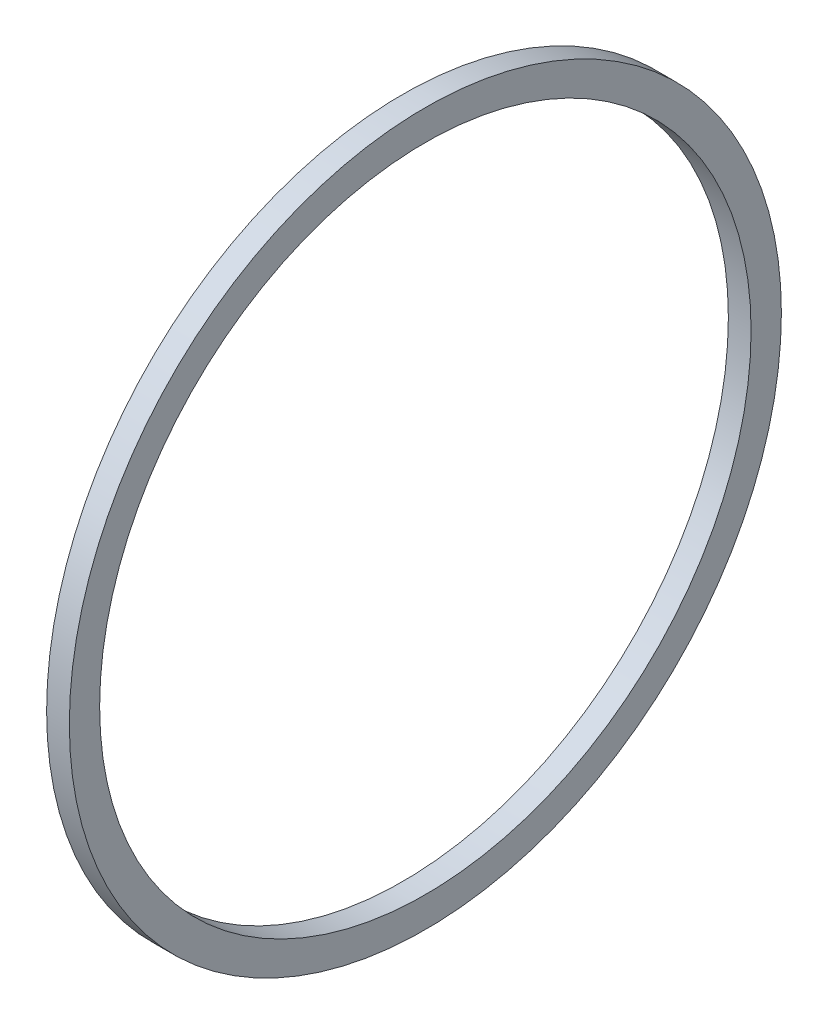
ISO-10303-21;
HEADER;
FILE_DESCRIPTION(('STEP AP214'),'2;1');
FILE_NAME('part.step','',(''),(''),'','','');
FILE_SCHEMA(('AUTOMOTIVE_DESIGN { 1 0 10303 214 1 1 1 1 }'));
ENDSEC;
DATA;
#1=APPLICATION_CONTEXT('core data for automotive mechanical design processes');
#2=APPLICATION_PROTOCOL_DEFINITION('international standard','automotive_design',2000,#1);
#3=PRODUCT_CONTEXT('',#1,'mechanical');
#4=PRODUCT('Part','Part','',(#3));
#5=PRODUCT_RELATED_PRODUCT_CATEGORY('part','',(#4));
#6=PRODUCT_DEFINITION_FORMATION('','',#4);
#7=PRODUCT_DEFINITION_CONTEXT('part definition',#1,'design');
#8=PRODUCT_DEFINITION('design','',#6,#7);
#9=PRODUCT_DEFINITION_SHAPE('','',#8);
#10=(LENGTH_UNIT() NAMED_UNIT(*) SI_UNIT(.MILLI.,.METRE.));
#11=(NAMED_UNIT(*) PLANE_ANGLE_UNIT() SI_UNIT($,.RADIAN.));
#12=(NAMED_UNIT(*) SI_UNIT($,.STERADIAN.) SOLID_ANGLE_UNIT());
#13=UNCERTAINTY_MEASURE_WITH_UNIT(LENGTH_MEASURE(1.E-05),#10,'distance_accuracy_value','');
#14=(GEOMETRIC_REPRESENTATION_CONTEXT(3) GLOBAL_UNCERTAINTY_ASSIGNED_CONTEXT((#13)) GLOBAL_UNIT_ASSIGNED_CONTEXT((#10,
#11,#12)) REPRESENTATION_CONTEXT('',''));
#15=CARTESIAN_POINT('',(0.,0.,0.));
#16=DIRECTION('',(0.,0.,1.));
#17=DIRECTION('',(1.,0.,0.));
#18=AXIS2_PLACEMENT_3D('',#15,#16,#17);
#19=CARTESIAN_POINT('',(3.,0.,0.));
#20=DIRECTION('',(1.,0.,0.));
#21=DIRECTION('',(0.,0.,-1.));
#22=AXIS2_PLACEMENT_3D('',#19,#20,#21);
#23=PLANE('',#22);
#24=CARTESIAN_POINT('',(3.,0.,0.));
#25=DIRECTION('',(1.,0.,0.));
#26=DIRECTION('',(0.,0.,-1.));
#27=AXIS2_PLACEMENT_3D('',#24,#25,#26);
#28=CIRCLE('',#27,47.);
#29=CARTESIAN_POINT('',(3.,0.,-47.));
#30=VERTEX_POINT('',#29);
#31=EDGE_CURVE('E10',#30,#30,#28,.T.);
#32=ORIENTED_EDGE('',*,*,#31,.T.);
#33=EDGE_LOOP('',(#32));
#34=FACE_BOUND('',#33,.T.);
#35=CARTESIAN_POINT('',(3.,0.,0.));
#36=DIRECTION('',(1.,0.,0.));
#37=DIRECTION('',(0.,0.,-1.));
#38=AXIS2_PLACEMENT_3D('',#35,#36,#37);
#39=CIRCLE('',#38,43.);
#40=CARTESIAN_POINT('',(3.,0.,-43.));
#41=VERTEX_POINT('',#40);
#42=EDGE_CURVE('E50',#41,#41,#39,.T.);
#43=ORIENTED_EDGE('',*,*,#42,.F.);
#44=EDGE_LOOP('',(#43));
#45=FACE_BOUND('',#44,.T.);
#46=ADVANCED_FACE('F37',(#34,#45),#23,.T.);
#47=CARTESIAN_POINT('',(0.,0.,0.));
#48=DIRECTION('',(1.,0.,0.));
#49=DIRECTION('',(0.,0.,-1.));
#50=AXIS2_PLACEMENT_3D('',#47,#48,#49);
#51=PLANE('',#50);
#52=CARTESIAN_POINT('',(0.,0.,0.));
#53=DIRECTION('',(1.,0.,0.));
#54=DIRECTION('',(0.,0.,-1.));
#55=AXIS2_PLACEMENT_3D('',#52,#53,#54);
#56=CIRCLE('',#55,47.);
#57=CARTESIAN_POINT('',(0.,0.,-47.));
#58=VERTEX_POINT('',#57);
#59=EDGE_CURVE('E41',#58,#58,#56,.T.);
#60=ORIENTED_EDGE('',*,*,#59,.F.);
#61=EDGE_LOOP('',(#60));
#62=FACE_BOUND('',#61,.T.);
#63=CARTESIAN_POINT('',(0.,0.,0.));
#64=DIRECTION('',(1.,0.,0.));
#65=DIRECTION('',(0.,0.,-1.));
#66=AXIS2_PLACEMENT_3D('',#63,#64,#65);
#67=CIRCLE('',#66,43.);
#68=CARTESIAN_POINT('',(0.,0.,-43.));
#69=VERTEX_POINT('',#68);
#70=EDGE_CURVE('E52',#69,#69,#67,.T.);
#71=ORIENTED_EDGE('',*,*,#70,.T.);
#72=EDGE_LOOP('',(#71));
#73=FACE_BOUND('',#72,.T.);
#74=ADVANCED_FACE('F64',(#62,#73),#51,.F.);
#75=CARTESIAN_POINT('',(3.,0.,0.));
#76=DIRECTION('',(-1.,0.,0.));
#77=DIRECTION('',(0.,0.,1.));
#78=AXIS2_PLACEMENT_3D('',#75,#76,#77);
#79=CYLINDRICAL_SURFACE('',#78,47.);
#80=ORIENTED_EDGE('',*,*,#31,.F.);
#81=EDGE_LOOP('',(#80));
#82=FACE_BOUND('',#81,.T.);
#83=ORIENTED_EDGE('',*,*,#59,.T.);
#84=EDGE_LOOP('',(#83));
#85=FACE_BOUND('',#84,.T.);
#86=ADVANCED_FACE('F39',(#82,#85),#79,.T.);
#87=CARTESIAN_POINT('',(3.,0.,0.));
#88=DIRECTION('',(-1.,0.,0.));
#89=DIRECTION('',(0.,0.,1.));
#90=AXIS2_PLACEMENT_3D('',#87,#88,#89);
#91=CYLINDRICAL_SURFACE('',#90,43.);
#92=ORIENTED_EDGE('',*,*,#42,.T.);
#93=EDGE_LOOP('',(#92));
#94=FACE_BOUND('',#93,.T.);
#95=ORIENTED_EDGE('',*,*,#70,.F.);
#96=EDGE_LOOP('',(#95));
#97=FACE_BOUND('',#96,.T.);
#98=ADVANCED_FACE('F60',(#94,#97),#91,.F.);
#99=CLOSED_SHELL('',(#46,#74,#86,#98));
#100=MANIFOLD_SOLID_BREP('B2',#99);
#101=ADVANCED_BREP_SHAPE_REPRESENTATION('',(#18,#100),#14);
#102=SHAPE_DEFINITION_REPRESENTATION(#9,#101);
ENDSEC;
END-ISO-10303-21;
